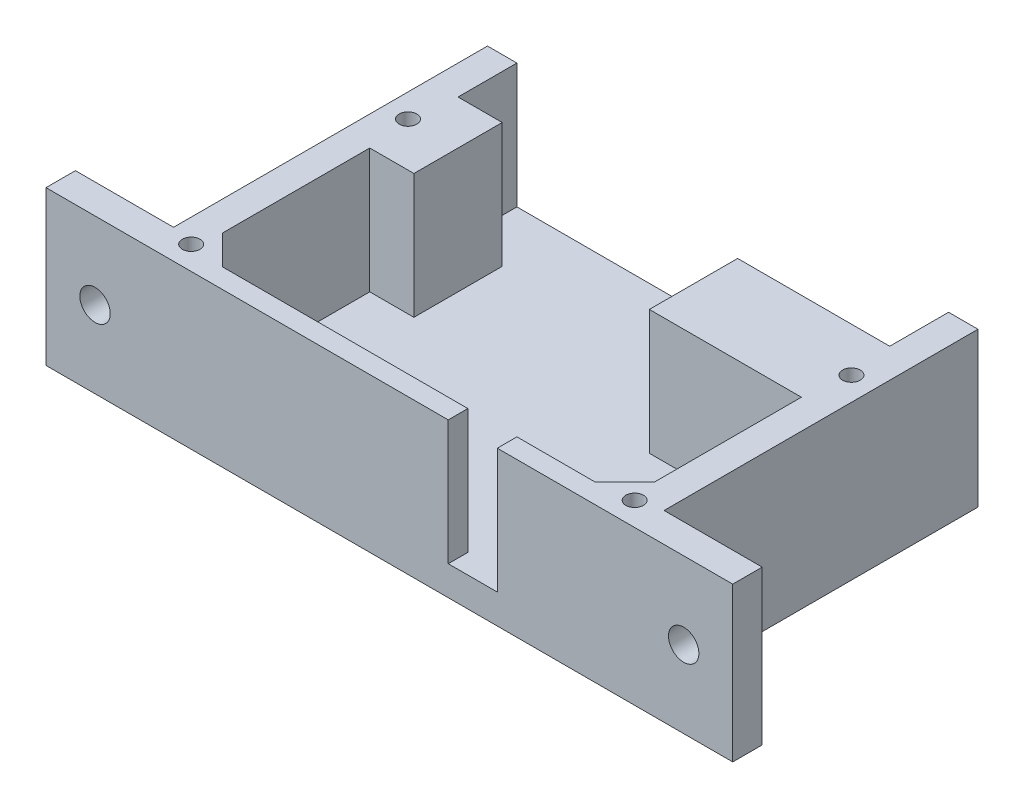
ISO-10303-21;
HEADER;
FILE_DESCRIPTION(('STEP AP214'),'2;1');
FILE_NAME('part.step','',(''),(''),'','','');
FILE_SCHEMA(('AUTOMOTIVE_DESIGN { 1 0 10303 214 1 1 1 1 }'));
ENDSEC;
DATA;
#1=APPLICATION_CONTEXT('core data for automotive mechanical design processes');
#2=APPLICATION_PROTOCOL_DEFINITION('international standard','automotive_design',2000,#1);
#3=PRODUCT_CONTEXT('',#1,'mechanical');
#4=PRODUCT('Part','Part','',(#3));
#5=PRODUCT_RELATED_PRODUCT_CATEGORY('part','',(#4));
#6=PRODUCT_DEFINITION_FORMATION('','',#4);
#7=PRODUCT_DEFINITION_CONTEXT('part definition',#1,'design');
#8=PRODUCT_DEFINITION('design','',#6,#7);
#9=PRODUCT_DEFINITION_SHAPE('','',#8);
#10=(LENGTH_UNIT() NAMED_UNIT(*) SI_UNIT(.MILLI.,.METRE.));
#11=(NAMED_UNIT(*) PLANE_ANGLE_UNIT() SI_UNIT($,.RADIAN.));
#12=(NAMED_UNIT(*) SI_UNIT($,.STERADIAN.) SOLID_ANGLE_UNIT());
#13=UNCERTAINTY_MEASURE_WITH_UNIT(LENGTH_MEASURE(1.E-05),#10,'distance_accuracy_value','');
#14=(GEOMETRIC_REPRESENTATION_CONTEXT(3) GLOBAL_UNCERTAINTY_ASSIGNED_CONTEXT((#13)) GLOBAL_UNIT_ASSIGNED_CONTEXT((#10,
#11,#12)) REPRESENTATION_CONTEXT('',''));
#15=CARTESIAN_POINT('',(0.,0.,0.));
#16=DIRECTION('',(0.,0.,1.));
#17=DIRECTION('',(1.,0.,0.));
#18=AXIS2_PLACEMENT_3D('',#15,#16,#17);
#19=CARTESIAN_POINT('',(25.,3.,-17.5));
#20=DIRECTION('',(-1.,0.,0.));
#21=DIRECTION('',(0.,0.,1.));
#22=AXIS2_PLACEMENT_3D('',#19,#20,#21);
#23=PLANE('',#22);
#24=DIRECTION('',(0.,1.,0.));
#25=VECTOR('',#24,1.);
#26=CARTESIAN_POINT('',(25.,15.7,14.5));
#27=LINE('',#26,#25);
#28=CARTESIAN_POINT('',(25.,0.,14.5));
#29=VERTEX_POINT('',#28);
#30=CARTESIAN_POINT('',(25.,15.7,14.5));
#31=VERTEX_POINT('',#30);
#32=EDGE_CURVE('E50',#29,#31,#27,.T.);
#33=ORIENTED_EDGE('',*,*,#32,.F.);
#34=DIRECTION('',(0.,0.,-1.));
#35=VECTOR('',#34,1.);
#36=CARTESIAN_POINT('',(25.,0.,-17.5));
#37=LINE('',#36,#35);
#38=CARTESIAN_POINT('',(25.,0.,-17.5));
#39=VERTEX_POINT('',#38);
#40=EDGE_CURVE('E425',#29,#39,#37,.T.);
#41=ORIENTED_EDGE('',*,*,#40,.T.);
#42=DIRECTION('',(0.,-1.,0.));
#43=VECTOR('',#42,1.);
#44=CARTESIAN_POINT('',(25.,3.,-17.5));
#45=LINE('',#44,#43);
#46=CARTESIAN_POINT('',(25.,15.7,-17.5));
#47=VERTEX_POINT('',#46);
#48=EDGE_CURVE('E436',#47,#39,#45,.T.);
#49=ORIENTED_EDGE('',*,*,#48,.F.);
#50=DIRECTION('',(0.,0.,-1.));
#51=VECTOR('',#50,1.);
#52=CARTESIAN_POINT('',(25.,15.7,0.));
#53=LINE('',#52,#51);
#54=EDGE_CURVE('E370',#31,#47,#53,.T.);
#55=ORIENTED_EDGE('',*,*,#54,.F.);
#56=EDGE_LOOP('',(#33,#41,#49,#55));
#57=FACE_BOUND('',#56,.T.);
#58=ADVANCED_FACE('F35',(#57),#23,.F.);
#59=CARTESIAN_POINT('',(-25.,3.,-17.5));
#60=DIRECTION('',(1.,0.,0.));
#61=DIRECTION('',(0.,0.,-1.));
#62=AXIS2_PLACEMENT_3D('',#59,#60,#61);
#63=PLANE('',#62);
#64=DIRECTION('',(0.,-1.,0.));
#65=VECTOR('',#64,1.);
#66=CARTESIAN_POINT('',(-25.,0.,14.5));
#67=LINE('',#66,#65);
#68=CARTESIAN_POINT('',(-25.,15.7,14.5));
#69=VERTEX_POINT('',#68);
#70=CARTESIAN_POINT('',(-25.,0.,14.5));
#71=VERTEX_POINT('',#70);
#72=EDGE_CURVE('E58',#69,#71,#67,.T.);
#73=ORIENTED_EDGE('',*,*,#72,.F.);
#74=DIRECTION('',(0.,0.,1.));
#75=VECTOR('',#74,1.);
#76=CARTESIAN_POINT('',(-25.,15.7,0.));
#77=LINE('',#76,#75);
#78=CARTESIAN_POINT('',(-25.,15.7,-17.5));
#79=VERTEX_POINT('',#78);
#80=EDGE_CURVE('E321',#79,#69,#77,.T.);
#81=ORIENTED_EDGE('',*,*,#80,.F.);
#82=DIRECTION('',(0.,-1.,0.));
#83=VECTOR('',#82,1.);
#84=CARTESIAN_POINT('',(-25.,3.,-17.5));
#85=LINE('',#84,#83);
#86=CARTESIAN_POINT('',(-25.,0.,-17.5));
#87=VERTEX_POINT('',#86);
#88=EDGE_CURVE('E429',#79,#87,#85,.T.);
#89=ORIENTED_EDGE('',*,*,#88,.T.);
#90=DIRECTION('',(0.,0.,1.));
#91=VECTOR('',#90,1.);
#92=CARTESIAN_POINT('',(-25.,0.,-17.5));
#93=LINE('',#92,#91);
#94=EDGE_CURVE('E220',#87,#71,#93,.T.);
#95=ORIENTED_EDGE('',*,*,#94,.T.);
#96=EDGE_LOOP('',(#73,#81,#89,#95));
#97=FACE_BOUND('',#96,.T.);
#98=ADVANCED_FACE('F550',(#97),#63,.F.);
#99=CARTESIAN_POINT('',(-25.,3.,-17.5));
#100=DIRECTION('',(0.,0.,1.));
#101=DIRECTION('',(1.,0.,0.));
#102=AXIS2_PLACEMENT_3D('',#99,#100,#101);
#103=PLANE('',#102);
#104=DIRECTION('',(-1.,0.,0.));
#105=VECTOR('',#104,1.);
#106=CARTESIAN_POINT('',(-25.,0.,-17.5));
#107=LINE('',#106,#105);
#108=EDGE_CURVE('E431',#39,#87,#107,.T.);
#109=ORIENTED_EDGE('',*,*,#108,.T.);
#110=ORIENTED_EDGE('',*,*,#88,.F.);
#111=DIRECTION('',(-1.,0.,0.));
#112=VECTOR('',#111,1.);
#113=CARTESIAN_POINT('',(0.,15.7,-17.5));
#114=LINE('',#113,#112);
#115=CARTESIAN_POINT('',(-22.,15.7,-17.5));
#116=VERTEX_POINT('',#115);
#117=EDGE_CURVE('E318',#116,#79,#114,.T.);
#118=ORIENTED_EDGE('',*,*,#117,.F.);
#119=DIRECTION('',(0.,-1.,0.));
#120=VECTOR('',#119,1.);
#121=CARTESIAN_POINT('',(-22.,15.7,-17.5));
#122=LINE('',#121,#120);
#123=CARTESIAN_POINT('',(-22.,3.,-17.5));
#124=VERTEX_POINT('',#123);
#125=EDGE_CURVE('E343',#116,#124,#122,.T.);
#126=ORIENTED_EDGE('',*,*,#125,.T.);
#127=DIRECTION('',(-1.,0.,0.));
#128=VECTOR('',#127,1.);
#129=CARTESIAN_POINT('',(-25.,3.,-17.5));
#130=LINE('',#129,#128);
#131=CARTESIAN_POINT('',(22.,3.,-17.5));
#132=VERTEX_POINT('',#131);
#133=EDGE_CURVE('E219',#132,#124,#130,.T.);
#134=ORIENTED_EDGE('',*,*,#133,.F.);
#135=DIRECTION('',(0.,-1.,0.));
#136=VECTOR('',#135,1.);
#137=CARTESIAN_POINT('',(22.,15.7,-17.5));
#138=LINE('',#137,#136);
#139=CARTESIAN_POINT('',(22.,15.7,-17.5));
#140=VERTEX_POINT('',#139);
#141=EDGE_CURVE('E416',#140,#132,#138,.T.);
#142=ORIENTED_EDGE('',*,*,#141,.F.);
#143=DIRECTION('',(-1.,0.,0.));
#144=VECTOR('',#143,1.);
#145=CARTESIAN_POINT('',(0.,15.7,-17.5));
#146=LINE('',#145,#144);
#147=EDGE_CURVE('E372',#47,#140,#146,.T.);
#148=ORIENTED_EDGE('',*,*,#147,.F.);
#149=ORIENTED_EDGE('',*,*,#48,.T.);
#150=EDGE_LOOP('',(#109,#110,#118,#126,#134,#142,#148,#149));
#151=FACE_BOUND('',#150,.T.);
#152=ADVANCED_FACE('F489',(#151),#103,.F.);
#153=CARTESIAN_POINT('',(-25.,3.,17.5));
#154=DIRECTION('',(0.,0.,-1.));
#155=DIRECTION('',(-1.,0.,0.));
#156=AXIS2_PLACEMENT_3D('',#153,#154,#155);
#157=PLANE('',#156);
#158=CARTESIAN_POINT('',(30.,7.85,17.5));
#159=DIRECTION('',(0.,0.,-1.));
#160=DIRECTION('',(-1.,0.,0.));
#161=AXIS2_PLACEMENT_3D('',#158,#159,#160);
#162=CIRCLE('',#161,1.55);
#163=CARTESIAN_POINT('',(28.45,7.85,17.5));
#164=VERTEX_POINT('',#163);
#165=EDGE_CURVE('E617',#164,#164,#162,.T.);
#166=ORIENTED_EDGE('',*,*,#165,.T.);
#167=EDGE_LOOP('',(#166));
#168=FACE_BOUND('',#167,.T.);
#169=CARTESIAN_POINT('',(-30.,7.85,17.5));
#170=DIRECTION('',(0.,0.,-1.));
#171=DIRECTION('',(-1.,0.,0.));
#172=AXIS2_PLACEMENT_3D('',#169,#170,#171);
#173=CIRCLE('',#172,1.55);
#174=CARTESIAN_POINT('',(-31.55,7.85,17.5));
#175=VERTEX_POINT('',#174);
#176=EDGE_CURVE('E236',#175,#175,#173,.T.);
#177=ORIENTED_EDGE('',*,*,#176,.T.);
#178=EDGE_LOOP('',(#177));
#179=FACE_BOUND('',#178,.T.);
#180=DIRECTION('',(1.,0.,0.));
#181=VECTOR('',#180,1.);
#182=CARTESIAN_POINT('',(-25.,0.,17.5));
#183=LINE('',#182,#181);
#184=CARTESIAN_POINT('',(-35.,0.,17.5));
#185=VERTEX_POINT('',#184);
#186=CARTESIAN_POINT('',(35.,0.,17.5));
#187=VERTEX_POINT('',#186);
#188=EDGE_CURVE('E208',#185,#187,#183,.T.);
#189=ORIENTED_EDGE('',*,*,#188,.T.);
#190=DIRECTION('',(0.,-1.,0.));
#191=VECTOR('',#190,1.);
#192=CARTESIAN_POINT('',(35.,15.7,17.5));
#193=LINE('',#192,#191);
#194=CARTESIAN_POINT('',(35.,15.7,17.5));
#195=VERTEX_POINT('',#194);
#196=EDGE_CURVE('E213',#195,#187,#193,.T.);
#197=ORIENTED_EDGE('',*,*,#196,.F.);
#198=DIRECTION('',(1.,0.,0.));
#199=VECTOR('',#198,1.);
#200=CARTESIAN_POINT('',(0.,15.7,17.5));
#201=LINE('',#200,#199);
#202=CARTESIAN_POINT('',(11.,15.7,17.5));
#203=VERTEX_POINT('',#202);
#204=EDGE_CURVE('E368',#203,#195,#201,.T.);
#205=ORIENTED_EDGE('',*,*,#204,.F.);
#206=DIRECTION('',(0.,-1.,0.));
#207=VECTOR('',#206,1.);
#208=CARTESIAN_POINT('',(11.,15.7,17.5));
#209=LINE('',#208,#207);
#210=CARTESIAN_POINT('',(11.,3.,17.5));
#211=VERTEX_POINT('',#210);
#212=EDGE_CURVE('E419',#203,#211,#209,.T.);
#213=ORIENTED_EDGE('',*,*,#212,.T.);
#214=DIRECTION('',(1.,0.,0.));
#215=VECTOR('',#214,1.);
#216=CARTESIAN_POINT('',(-25.,3.,17.5));
#217=LINE('',#216,#215);
#218=CARTESIAN_POINT('',(6.00000000000001,3.,17.5));
#219=VERTEX_POINT('',#218);
#220=EDGE_CURVE('E427',#219,#211,#217,.T.);
#221=ORIENTED_EDGE('',*,*,#220,.F.);
#222=DIRECTION('',(0.,-1.,0.));
#223=VECTOR('',#222,1.);
#224=CARTESIAN_POINT('',(6.00000000000001,15.7,17.5));
#225=LINE('',#224,#223);
#226=CARTESIAN_POINT('',(6.00000000000001,15.7,17.5));
#227=VERTEX_POINT('',#226);
#228=EDGE_CURVE('E325',#227,#219,#225,.T.);
#229=ORIENTED_EDGE('',*,*,#228,.F.);
#230=DIRECTION('',(1.,0.,0.));
#231=VECTOR('',#230,1.);
#232=CARTESIAN_POINT('',(0.,15.7,17.5));
#233=LINE('',#232,#231);
#234=CARTESIAN_POINT('',(-35.,15.7,17.5));
#235=VERTEX_POINT('',#234);
#236=EDGE_CURVE('E323',#235,#227,#233,.T.);
#237=ORIENTED_EDGE('',*,*,#236,.F.);
#238=DIRECTION('',(0.,1.,0.));
#239=VECTOR('',#238,1.);
#240=CARTESIAN_POINT('',(-35.,0.,17.5));
#241=LINE('',#240,#239);
#242=EDGE_CURVE('E215',#185,#235,#241,.T.);
#243=ORIENTED_EDGE('',*,*,#242,.F.);
#244=EDGE_LOOP('',(#189,#197,#205,#213,#221,#229,#237,#243));
#245=FACE_BOUND('',#244,.T.);
#246=ADVANCED_FACE('F210',(#168,#179,#245),#157,.F.);
#247=CARTESIAN_POINT('',(0.,3.,0.));
#248=DIRECTION('',(0.,1.,0.));
#249=DIRECTION('',(0.,0.,1.));
#250=AXIS2_PLACEMENT_3D('',#247,#248,#249);
#251=PLANE('',#250);
#252=DIRECTION('',(1.,0.,0.));
#253=VECTOR('',#252,1.);
#254=CARTESIAN_POINT('',(0.,3.,15.5));
#255=LINE('',#254,#253);
#256=CARTESIAN_POINT('',(11.,3.,15.5));
#257=VERTEX_POINT('',#256);
#258=CARTESIAN_POINT('',(19.,3.,15.5));
#259=VERTEX_POINT('',#258);
#260=EDGE_CURVE('E361',#257,#259,#255,.T.);
#261=ORIENTED_EDGE('',*,*,#260,.T.);
#262=DIRECTION('',(0.707106781186551,0.,-0.707106781186544));
#263=VECTOR('',#262,1.);
#264=CARTESIAN_POINT('',(17.2499999999999,3.,17.2500000000001));
#265=LINE('',#264,#263);
#266=CARTESIAN_POINT('',(22.,3.,12.5));
#267=VERTEX_POINT('',#266);
#268=EDGE_CURVE('E444',#259,#267,#265,.T.);
#269=ORIENTED_EDGE('',*,*,#268,.T.);
#270=DIRECTION('',(0.,0.,1.));
#271=VECTOR('',#270,1.);
#272=CARTESIAN_POINT('',(22.,3.,0.));
#273=LINE('',#272,#271);
#274=CARTESIAN_POINT('',(22.,3.,-2.5));
#275=VERTEX_POINT('',#274);
#276=EDGE_CURVE('E366',#275,#267,#273,.T.);
#277=ORIENTED_EDGE('',*,*,#276,.F.);
#278=DIRECTION('',(-1.,0.,0.));
#279=VECTOR('',#278,1.);
#280=CARTESIAN_POINT('',(0.,3.,-2.5));
#281=LINE('',#280,#279);
#282=CARTESIAN_POINT('',(6.50000000000001,3.,-2.5));
#283=VERTEX_POINT('',#282);
#284=EDGE_CURVE('E401',#275,#283,#281,.T.);
#285=ORIENTED_EDGE('',*,*,#284,.T.);
#286=DIRECTION('',(0.,0.,1.));
#287=VECTOR('',#286,1.);
#288=CARTESIAN_POINT('',(6.50000000000001,3.,0.));
#289=LINE('',#288,#287);
#290=CARTESIAN_POINT('',(6.50000000000001,3.,-11.5));
#291=VERTEX_POINT('',#290);
#292=EDGE_CURVE('E398',#291,#283,#289,.T.);
#293=ORIENTED_EDGE('',*,*,#292,.F.);
#294=DIRECTION('',(-1.,0.,0.));
#295=VECTOR('',#294,1.);
#296=CARTESIAN_POINT('',(0.,3.,-11.5));
#297=LINE('',#296,#295);
#298=CARTESIAN_POINT('',(22.,3.,-11.5));
#299=VERTEX_POINT('',#298);
#300=EDGE_CURVE('E395',#299,#291,#297,.T.);
#301=ORIENTED_EDGE('',*,*,#300,.F.);
#302=DIRECTION('',(0.,0.,1.));
#303=VECTOR('',#302,1.);
#304=CARTESIAN_POINT('',(22.,3.,0.));
#305=LINE('',#304,#303);
#306=EDGE_CURVE('E392',#132,#299,#305,.T.);
#307=ORIENTED_EDGE('',*,*,#306,.F.);
#308=ORIENTED_EDGE('',*,*,#133,.T.);
#309=DIRECTION('',(0.,0.,1.));
#310=VECTOR('',#309,1.);
#311=CARTESIAN_POINT('',(-22.,3.,0.));
#312=LINE('',#311,#310);
#313=CARTESIAN_POINT('',(-22.,3.,-11.5));
#314=VERTEX_POINT('',#313);
#315=EDGE_CURVE('E302',#124,#314,#312,.T.);
#316=ORIENTED_EDGE('',*,*,#315,.T.);
#317=DIRECTION('',(1.,0.,0.));
#318=VECTOR('',#317,1.);
#319=CARTESIAN_POINT('',(0.,3.,-11.5));
#320=LINE('',#319,#318);
#321=CARTESIAN_POINT('',(-17.5,3.,-11.5));
#322=VERTEX_POINT('',#321);
#323=EDGE_CURVE('E338',#314,#322,#320,.T.);
#324=ORIENTED_EDGE('',*,*,#323,.T.);
#325=DIRECTION('',(0.,0.,1.));
#326=VECTOR('',#325,1.);
#327=CARTESIAN_POINT('',(-17.5,3.,0.));
#328=LINE('',#327,#326);
#329=CARTESIAN_POINT('',(-17.5,3.,-2.5));
#330=VERTEX_POINT('',#329);
#331=EDGE_CURVE('E336',#322,#330,#328,.T.);
#332=ORIENTED_EDGE('',*,*,#331,.T.);
#333=DIRECTION('',(1.,0.,0.));
#334=VECTOR('',#333,1.);
#335=CARTESIAN_POINT('',(0.,3.,-2.50000000000001));
#336=LINE('',#335,#334);
#337=CARTESIAN_POINT('',(-22.,3.,-2.5));
#338=VERTEX_POINT('',#337);
#339=EDGE_CURVE('E333',#338,#330,#336,.T.);
#340=ORIENTED_EDGE('',*,*,#339,.F.);
#341=DIRECTION('',(0.,0.,1.));
#342=VECTOR('',#341,1.);
#343=CARTESIAN_POINT('',(-22.,3.,0.));
#344=LINE('',#343,#342);
#345=CARTESIAN_POINT('',(-22.,3.,12.5));
#346=VERTEX_POINT('',#345);
#347=EDGE_CURVE('E330',#338,#346,#344,.T.);
#348=ORIENTED_EDGE('',*,*,#347,.T.);
#349=DIRECTION('',(-0.707106781186543,0.,-0.707106781186552));
#350=VECTOR('',#349,1.);
#351=CARTESIAN_POINT('',(-17.2500000000001,3.,17.2499999999999));
#352=LINE('',#351,#350);
#353=CARTESIAN_POINT('',(-19.,3.,15.5));
#354=VERTEX_POINT('',#353);
#355=EDGE_CURVE('E442',#346,#354,#352,.F.);
#356=ORIENTED_EDGE('',*,*,#355,.T.);
#357=DIRECTION('',(1.,0.,0.));
#358=VECTOR('',#357,1.);
#359=CARTESIAN_POINT('',(0.,3.,15.5));
#360=LINE('',#359,#358);
#361=CARTESIAN_POINT('',(6.00000000000001,3.,15.5));
#362=VERTEX_POINT('',#361);
#363=EDGE_CURVE('E328',#354,#362,#360,.T.);
#364=ORIENTED_EDGE('',*,*,#363,.T.);
#365=DIRECTION('',(0.,0.,1.));
#366=VECTOR('',#365,1.);
#367=CARTESIAN_POINT('',(6.00000000000001,3.,0.));
#368=LINE('',#367,#366);
#369=EDGE_CURVE('E295',#362,#219,#368,.T.);
#370=ORIENTED_EDGE('',*,*,#369,.T.);
#371=ORIENTED_EDGE('',*,*,#220,.T.);
#372=DIRECTION('',(0.,0.,1.));
#373=VECTOR('',#372,1.);
#374=CARTESIAN_POINT('',(11.,3.,0.));
#375=LINE('',#374,#373);
#376=EDGE_CURVE('E389',#257,#211,#375,.T.);
#377=ORIENTED_EDGE('',*,*,#376,.F.);
#378=EDGE_LOOP('',(#261,#269,#277,#285,#293,#301,#307,#308,#316,#324,#332,#340,#348,#356,#364,
#370,#371,#377));
#379=FACE_BOUND('',#378,.T.);
#380=ADVANCED_FACE('F467',(#379),#251,.T.);
#381=CARTESIAN_POINT('',(0.,0.,0.));
#382=DIRECTION('',(0.,1.,0.));
#383=DIRECTION('',(0.,0.,1.));
#384=AXIS2_PLACEMENT_3D('',#381,#382,#383);
#385=PLANE('',#384);
#386=ORIENTED_EDGE('',*,*,#40,.F.);
#387=DIRECTION('',(-1.,0.,0.));
#388=VECTOR('',#387,1.);
#389=CARTESIAN_POINT('',(35.,0.,14.5));
#390=LINE('',#389,#388);
#391=CARTESIAN_POINT('',(35.,0.,14.5));
#392=VERTEX_POINT('',#391);
#393=EDGE_CURVE('E226',#392,#29,#390,.T.);
#394=ORIENTED_EDGE('',*,*,#393,.F.);
#395=DIRECTION('',(0.,0.,-1.));
#396=VECTOR('',#395,1.);
#397=CARTESIAN_POINT('',(35.,0.,17.5));
#398=LINE('',#397,#396);
#399=EDGE_CURVE('E223',#187,#392,#398,.T.);
#400=ORIENTED_EDGE('',*,*,#399,.F.);
#401=ORIENTED_EDGE('',*,*,#188,.F.);
#402=DIRECTION('',(0.,0.,1.));
#403=VECTOR('',#402,1.);
#404=CARTESIAN_POINT('',(-35.,0.,17.5));
#405=LINE('',#404,#403);
#406=CARTESIAN_POINT('',(-35.,0.,14.5));
#407=VERTEX_POINT('',#406);
#408=EDGE_CURVE('E252',#407,#185,#405,.T.);
#409=ORIENTED_EDGE('',*,*,#408,.F.);
#410=DIRECTION('',(1.,0.,0.));
#411=VECTOR('',#410,1.);
#412=CARTESIAN_POINT('',(-35.,0.,14.5));
#413=LINE('',#412,#411);
#414=EDGE_CURVE('E254',#407,#71,#413,.T.);
#415=ORIENTED_EDGE('',*,*,#414,.T.);
#416=ORIENTED_EDGE('',*,*,#94,.F.);
#417=ORIENTED_EDGE('',*,*,#108,.F.);
#418=EDGE_LOOP('',(#386,#394,#400,#401,#409,#415,#416,#417));
#419=FACE_BOUND('',#418,.T.);
#420=ADVANCED_FACE('F224',(#419),#385,.F.);
#421=CARTESIAN_POINT('',(0.,15.7,15.5));
#422=DIRECTION('',(0.,0.,-1.));
#423=DIRECTION('',(-1.,0.,0.));
#424=AXIS2_PLACEMENT_3D('',#421,#422,#423);
#425=PLANE('',#424);
#426=DIRECTION('',(1.,0.,0.));
#427=VECTOR('',#426,1.);
#428=CARTESIAN_POINT('',(0.,15.7,15.5));
#429=LINE('',#428,#427);
#430=CARTESIAN_POINT('',(11.,15.7,15.5));
#431=VERTEX_POINT('',#430);
#432=CARTESIAN_POINT('',(19.,15.7,15.5));
#433=VERTEX_POINT('',#432);
#434=EDGE_CURVE('E362',#431,#433,#429,.T.);
#435=ORIENTED_EDGE('',*,*,#434,.T.);
#436=DIRECTION('',(0.,-1.,0.));
#437=VECTOR('',#436,1.);
#438=CARTESIAN_POINT('',(19.,15.7,15.5));
#439=LINE('',#438,#437);
#440=EDGE_CURVE('E439',#433,#259,#439,.T.);
#441=ORIENTED_EDGE('',*,*,#440,.T.);
#442=ORIENTED_EDGE('',*,*,#260,.F.);
#443=DIRECTION('',(0.,-1.,0.));
#444=VECTOR('',#443,1.);
#445=CARTESIAN_POINT('',(11.,15.7,15.5));
#446=LINE('',#445,#444);
#447=EDGE_CURVE('E422',#431,#257,#446,.T.);
#448=ORIENTED_EDGE('',*,*,#447,.F.);
#449=EDGE_LOOP('',(#435,#441,#442,#448));
#450=FACE_BOUND('',#449,.T.);
#451=ADVANCED_FACE('F462',(#450),#425,.T.);
#452=CARTESIAN_POINT('',(11.,15.7,0.));
#453=DIRECTION('',(1.,0.,0.));
#454=DIRECTION('',(0.,0.,-1.));
#455=AXIS2_PLACEMENT_3D('',#452,#453,#454);
#456=PLANE('',#455);
#457=ORIENTED_EDGE('',*,*,#376,.T.);
#458=ORIENTED_EDGE('',*,*,#212,.F.);
#459=DIRECTION('',(0.,0.,1.));
#460=VECTOR('',#459,1.);
#461=CARTESIAN_POINT('',(11.,15.7,0.));
#462=LINE('',#461,#460);
#463=EDGE_CURVE('E365',#431,#203,#462,.T.);
#464=ORIENTED_EDGE('',*,*,#463,.F.);
#465=ORIENTED_EDGE('',*,*,#447,.T.);
#466=EDGE_LOOP('',(#457,#458,#464,#465));
#467=FACE_BOUND('',#466,.T.);
#468=ADVANCED_FACE('F530',(#467),#456,.F.);
#469=CARTESIAN_POINT('',(22.,15.7,0.));
#470=DIRECTION('',(1.,0.,0.));
#471=DIRECTION('',(0.,0.,-1.));
#472=AXIS2_PLACEMENT_3D('',#469,#470,#471);
#473=PLANE('',#472);
#474=ORIENTED_EDGE('',*,*,#306,.T.);
#475=DIRECTION('',(0.,-1.,0.));
#476=VECTOR('',#475,1.);
#477=CARTESIAN_POINT('',(22.,15.7,-11.5));
#478=LINE('',#477,#476);
#479=CARTESIAN_POINT('',(22.,15.7,-11.5));
#480=VERTEX_POINT('',#479);
#481=EDGE_CURVE('E413',#480,#299,#478,.T.);
#482=ORIENTED_EDGE('',*,*,#481,.F.);
#483=DIRECTION('',(0.,0.,1.));
#484=VECTOR('',#483,1.);
#485=CARTESIAN_POINT('',(22.,15.7,0.));
#486=LINE('',#485,#484);
#487=EDGE_CURVE('E374',#140,#480,#486,.T.);
#488=ORIENTED_EDGE('',*,*,#487,.F.);
#489=ORIENTED_EDGE('',*,*,#141,.T.);
#490=EDGE_LOOP('',(#474,#482,#488,#489));
#491=FACE_BOUND('',#490,.T.);
#492=ADVANCED_FACE('F486',(#491),#473,.F.);
#493=CARTESIAN_POINT('',(0.,15.7,-11.5));
#494=DIRECTION('',(0.,0.,1.));
#495=DIRECTION('',(1.,0.,0.));
#496=AXIS2_PLACEMENT_3D('',#493,#494,#495);
#497=PLANE('',#496);
#498=CARTESIAN_POINT('',(9.00000000000001,9.35,-11.5));
#499=DIRECTION('',(0.,0.,-1.));
#500=DIRECTION('',(-1.,0.,0.));
#501=AXIS2_PLACEMENT_3D('',#498,#499,#500);
#502=CIRCLE('',#501,0.9);
#503=CARTESIAN_POINT('',(8.10000000000001,9.35,-11.5));
#504=VERTEX_POINT('',#503);
#505=EDGE_CURVE('E261',#504,#504,#502,.T.);
#506=ORIENTED_EDGE('',*,*,#505,.F.);
#507=EDGE_LOOP('',(#506));
#508=FACE_BOUND('',#507,.T.);
#509=ORIENTED_EDGE('',*,*,#300,.T.);
#510=DIRECTION('',(0.,-1.,0.));
#511=VECTOR('',#510,1.);
#512=CARTESIAN_POINT('',(6.50000000000001,15.7,-11.5));
#513=LINE('',#512,#511);
#514=CARTESIAN_POINT('',(6.50000000000001,15.7,-11.5));
#515=VERTEX_POINT('',#514);
#516=EDGE_CURVE('E410',#515,#291,#513,.T.);
#517=ORIENTED_EDGE('',*,*,#516,.F.);
#518=DIRECTION('',(-1.,0.,0.));
#519=VECTOR('',#518,1.);
#520=CARTESIAN_POINT('',(0.,15.7,-11.5));
#521=LINE('',#520,#519);
#522=EDGE_CURVE('E376',#480,#515,#521,.T.);
#523=ORIENTED_EDGE('',*,*,#522,.F.);
#524=ORIENTED_EDGE('',*,*,#481,.T.);
#525=EDGE_LOOP('',(#509,#517,#523,#524));
#526=FACE_BOUND('',#525,.T.);
#527=ADVANCED_FACE('F477',(#508,#526),#497,.F.);
#528=CARTESIAN_POINT('',(6.50000000000001,15.7,0.));
#529=DIRECTION('',(1.,0.,0.));
#530=DIRECTION('',(0.,0.,-1.));
#531=AXIS2_PLACEMENT_3D('',#528,#529,#530);
#532=PLANE('',#531);
#533=ORIENTED_EDGE('',*,*,#292,.T.);
#534=DIRECTION('',(0.,-1.,0.));
#535=VECTOR('',#534,1.);
#536=CARTESIAN_POINT('',(6.50000000000001,15.7,-2.5));
#537=LINE('',#536,#535);
#538=CARTESIAN_POINT('',(6.50000000000001,15.7,-2.5));
#539=VERTEX_POINT('',#538);
#540=EDGE_CURVE('E407',#539,#283,#537,.T.);
#541=ORIENTED_EDGE('',*,*,#540,.F.);
#542=DIRECTION('',(0.,0.,1.));
#543=VECTOR('',#542,1.);
#544=CARTESIAN_POINT('',(6.50000000000001,15.7,0.));
#545=LINE('',#544,#543);
#546=EDGE_CURVE('E378',#515,#539,#545,.T.);
#547=ORIENTED_EDGE('',*,*,#546,.F.);
#548=ORIENTED_EDGE('',*,*,#516,.T.);
#549=EDGE_LOOP('',(#533,#541,#547,#548));
#550=FACE_BOUND('',#549,.T.);
#551=ADVANCED_FACE('F481',(#550),#532,.F.);
#552=CARTESIAN_POINT('',(0.,15.7,-2.5));
#553=DIRECTION('',(0.,0.,1.));
#554=DIRECTION('',(1.,0.,0.));
#555=AXIS2_PLACEMENT_3D('',#552,#553,#554);
#556=PLANE('',#555);
#557=ORIENTED_EDGE('',*,*,#284,.F.);
#558=DIRECTION('',(0.,-1.,0.));
#559=VECTOR('',#558,1.);
#560=CARTESIAN_POINT('',(22.,15.7,-2.5));
#561=LINE('',#560,#559);
#562=CARTESIAN_POINT('',(22.,15.7,-2.5));
#563=VERTEX_POINT('',#562);
#564=EDGE_CURVE('E386',#563,#275,#561,.T.);
#565=ORIENTED_EDGE('',*,*,#564,.F.);
#566=DIRECTION('',(-1.,0.,0.));
#567=VECTOR('',#566,1.);
#568=CARTESIAN_POINT('',(0.,15.7,-2.5));
#569=LINE('',#568,#567);
#570=EDGE_CURVE('E380',#563,#539,#569,.T.);
#571=ORIENTED_EDGE('',*,*,#570,.T.);
#572=ORIENTED_EDGE('',*,*,#540,.T.);
#573=EDGE_LOOP('',(#557,#565,#571,#572));
#574=FACE_BOUND('',#573,.T.);
#575=ADVANCED_FACE('F472',(#574),#556,.T.);
#576=CARTESIAN_POINT('',(22.,15.7,0.));
#577=DIRECTION('',(1.,0.,0.));
#578=DIRECTION('',(0.,0.,-1.));
#579=AXIS2_PLACEMENT_3D('',#576,#577,#578);
#580=PLANE('',#579);
#581=ORIENTED_EDGE('',*,*,#276,.T.);
#582=DIRECTION('',(0.,1.,0.));
#583=VECTOR('',#582,1.);
#584=CARTESIAN_POINT('',(22.,15.7,12.5));
#585=LINE('',#584,#583);
#586=CARTESIAN_POINT('',(22.,15.7,12.5));
#587=VERTEX_POINT('',#586);
#588=EDGE_CURVE('E446',#267,#587,#585,.T.);
#589=ORIENTED_EDGE('',*,*,#588,.T.);
#590=DIRECTION('',(0.,0.,1.));
#591=VECTOR('',#590,1.);
#592=CARTESIAN_POINT('',(22.,15.7,0.));
#593=LINE('',#592,#591);
#594=EDGE_CURVE('E383',#563,#587,#593,.T.);
#595=ORIENTED_EDGE('',*,*,#594,.F.);
#596=ORIENTED_EDGE('',*,*,#564,.T.);
#597=EDGE_LOOP('',(#581,#589,#595,#596));
#598=FACE_BOUND('',#597,.T.);
#599=ADVANCED_FACE('F469',(#598),#580,.F.);
#600=CARTESIAN_POINT('',(0.,15.7,0.));
#601=DIRECTION('',(0.,1.,0.));
#602=DIRECTION('',(0.,0.,1.));
#603=AXIS2_PLACEMENT_3D('',#600,#601,#602);
#604=PLANE('',#603);
#605=CARTESIAN_POINT('',(22.6,15.7,15.1));
#606=DIRECTION('',(0.,1.,0.));
#607=DIRECTION('',(0.,0.,1.));
#608=AXIS2_PLACEMENT_3D('',#605,#606,#607);
#609=CIRCLE('',#608,0.9);
#610=CARTESIAN_POINT('',(22.6,15.7,16.));
#611=VERTEX_POINT('',#610);
#612=EDGE_CURVE('E284',#611,#611,#609,.T.);
#613=ORIENTED_EDGE('',*,*,#612,.F.);
#614=EDGE_LOOP('',(#613));
#615=FACE_BOUND('',#614,.T.);
#616=CARTESIAN_POINT('',(22.6,15.7,-7.));
#617=DIRECTION('',(0.,1.,0.));
#618=DIRECTION('',(0.,0.,1.));
#619=AXIS2_PLACEMENT_3D('',#616,#617,#618);
#620=CIRCLE('',#619,0.9);
#621=CARTESIAN_POINT('',(22.6,15.7,-6.1));
#622=VERTEX_POINT('',#621);
#623=EDGE_CURVE('E277',#622,#622,#620,.T.);
#624=ORIENTED_EDGE('',*,*,#623,.F.);
#625=EDGE_LOOP('',(#624));
#626=FACE_BOUND('',#625,.T.);
#627=ORIENTED_EDGE('',*,*,#434,.F.);
#628=ORIENTED_EDGE('',*,*,#463,.T.);
#629=ORIENTED_EDGE('',*,*,#204,.T.);
#630=DIRECTION('',(0.,0.,1.));
#631=VECTOR('',#630,1.);
#632=CARTESIAN_POINT('',(35.,15.7,17.5));
#633=LINE('',#632,#631);
#634=CARTESIAN_POINT('',(35.,15.7,14.5));
#635=VERTEX_POINT('',#634);
#636=EDGE_CURVE('E234',#635,#195,#633,.T.);
#637=ORIENTED_EDGE('',*,*,#636,.F.);
#638=DIRECTION('',(-1.,0.,0.));
#639=VECTOR('',#638,1.);
#640=CARTESIAN_POINT('',(35.,15.7,14.5));
#641=LINE('',#640,#639);
#642=EDGE_CURVE('E242',#635,#31,#641,.T.);
#643=ORIENTED_EDGE('',*,*,#642,.T.);
#644=ORIENTED_EDGE('',*,*,#54,.T.);
#645=ORIENTED_EDGE('',*,*,#147,.T.);
#646=ORIENTED_EDGE('',*,*,#487,.T.);
#647=ORIENTED_EDGE('',*,*,#522,.T.);
#648=ORIENTED_EDGE('',*,*,#546,.T.);
#649=ORIENTED_EDGE('',*,*,#570,.F.);
#650=ORIENTED_EDGE('',*,*,#594,.T.);
#651=DIRECTION('',(-0.707106781186551,0.,0.707106781186544));
#652=VECTOR('',#651,1.);
#653=CARTESIAN_POINT('',(19.,15.7,15.5));
#654=LINE('',#653,#652);
#655=EDGE_CURVE('E43',#587,#433,#654,.T.);
#656=ORIENTED_EDGE('',*,*,#655,.T.);
#657=EDGE_LOOP('',(#627,#628,#629,#637,#643,#644,#645,#646,#647,#648,#649,#650,#656));
#658=FACE_BOUND('',#657,.T.);
#659=ADVANCED_FACE('F455',(#615,#626,#658),#604,.T.);
#660=CARTESIAN_POINT('',(6.00000000000001,15.7,0.));
#661=DIRECTION('',(1.,0.,0.));
#662=DIRECTION('',(0.,0.,-1.));
#663=AXIS2_PLACEMENT_3D('',#660,#661,#662);
#664=PLANE('',#663);
#665=ORIENTED_EDGE('',*,*,#369,.F.);
#666=DIRECTION('',(0.,-1.,0.));
#667=VECTOR('',#666,1.);
#668=CARTESIAN_POINT('',(6.00000000000001,15.7,15.5));
#669=LINE('',#668,#667);
#670=CARTESIAN_POINT('',(6.00000000000001,15.7,15.5));
#671=VERTEX_POINT('',#670);
#672=EDGE_CURVE('E358',#671,#362,#669,.T.);
#673=ORIENTED_EDGE('',*,*,#672,.F.);
#674=DIRECTION('',(0.,0.,1.));
#675=VECTOR('',#674,1.);
#676=CARTESIAN_POINT('',(6.00000000000001,15.7,0.));
#677=LINE('',#676,#675);
#678=EDGE_CURVE('E298',#671,#227,#677,.T.);
#679=ORIENTED_EDGE('',*,*,#678,.T.);
#680=ORIENTED_EDGE('',*,*,#228,.T.);
#681=EDGE_LOOP('',(#665,#673,#679,#680));
#682=FACE_BOUND('',#681,.T.);
#683=ADVANCED_FACE('F527',(#682),#664,.T.);
#684=CARTESIAN_POINT('',(0.,15.7,15.5));
#685=DIRECTION('',(0.,0.,-1.));
#686=DIRECTION('',(-1.,0.,0.));
#687=AXIS2_PLACEMENT_3D('',#684,#685,#686);
#688=PLANE('',#687);
#689=ORIENTED_EDGE('',*,*,#363,.F.);
#690=DIRECTION('',(0.,1.,0.));
#691=VECTOR('',#690,1.);
#692=CARTESIAN_POINT('',(-19.,15.7,15.5));
#693=LINE('',#692,#691);
#694=CARTESIAN_POINT('',(-19.,15.7,15.5));
#695=VERTEX_POINT('',#694);
#696=EDGE_CURVE('E451',#354,#695,#693,.T.);
#697=ORIENTED_EDGE('',*,*,#696,.T.);
#698=DIRECTION('',(1.,0.,0.));
#699=VECTOR('',#698,1.);
#700=CARTESIAN_POINT('',(0.,15.7,15.5));
#701=LINE('',#700,#699);
#702=EDGE_CURVE('E301',#695,#671,#701,.T.);
#703=ORIENTED_EDGE('',*,*,#702,.T.);
#704=ORIENTED_EDGE('',*,*,#672,.T.);
#705=EDGE_LOOP('',(#689,#697,#703,#704));
#706=FACE_BOUND('',#705,.T.);
#707=ADVANCED_FACE('F518',(#706),#688,.T.);
#708=CARTESIAN_POINT('',(-22.,15.7,0.));
#709=DIRECTION('',(1.,0.,0.));
#710=DIRECTION('',(0.,0.,-1.));
#711=AXIS2_PLACEMENT_3D('',#708,#709,#710);
#712=PLANE('',#711);
#713=DIRECTION('',(0.,0.,1.));
#714=VECTOR('',#713,1.);
#715=CARTESIAN_POINT('',(-22.,15.7,0.));
#716=LINE('',#715,#714);
#717=CARTESIAN_POINT('',(-22.,15.7,-2.5));
#718=VERTEX_POINT('',#717);
#719=CARTESIAN_POINT('',(-22.,15.7,12.5));
#720=VERTEX_POINT('',#719);
#721=EDGE_CURVE('E304',#718,#720,#716,.T.);
#722=ORIENTED_EDGE('',*,*,#721,.T.);
#723=DIRECTION('',(0.,-1.,0.));
#724=VECTOR('',#723,1.);
#725=CARTESIAN_POINT('',(-22.,3.,12.5));
#726=LINE('',#725,#724);
#727=EDGE_CURVE('E448',#720,#346,#726,.T.);
#728=ORIENTED_EDGE('',*,*,#727,.T.);
#729=ORIENTED_EDGE('',*,*,#347,.F.);
#730=DIRECTION('',(0.,-1.,0.));
#731=VECTOR('',#730,1.);
#732=CARTESIAN_POINT('',(-22.,15.7,-2.5));
#733=LINE('',#732,#731);
#734=EDGE_CURVE('E355',#718,#338,#733,.T.);
#735=ORIENTED_EDGE('',*,*,#734,.F.);
#736=EDGE_LOOP('',(#722,#728,#729,#735));
#737=FACE_BOUND('',#736,.T.);
#738=ADVANCED_FACE('F510',(#737),#712,.T.);
#739=CARTESIAN_POINT('',(0.,15.7,-2.50000000000001));
#740=DIRECTION('',(0.,0.,-1.));
#741=DIRECTION('',(-1.,0.,0.));
#742=AXIS2_PLACEMENT_3D('',#739,#740,#741);
#743=PLANE('',#742);
#744=ORIENTED_EDGE('',*,*,#339,.T.);
#745=DIRECTION('',(0.,-1.,0.));
#746=VECTOR('',#745,1.);
#747=CARTESIAN_POINT('',(-17.5,15.7,-2.5));
#748=LINE('',#747,#746);
#749=CARTESIAN_POINT('',(-17.5,15.7,-2.5));
#750=VERTEX_POINT('',#749);
#751=EDGE_CURVE('E352',#750,#330,#748,.T.);
#752=ORIENTED_EDGE('',*,*,#751,.F.);
#753=DIRECTION('',(1.,0.,0.));
#754=VECTOR('',#753,1.);
#755=CARTESIAN_POINT('',(0.,15.7,-2.50000000000001));
#756=LINE('',#755,#754);
#757=EDGE_CURVE('E307',#718,#750,#756,.T.);
#758=ORIENTED_EDGE('',*,*,#757,.F.);
#759=ORIENTED_EDGE('',*,*,#734,.T.);
#760=EDGE_LOOP('',(#744,#752,#758,#759));
#761=FACE_BOUND('',#760,.T.);
#762=ADVANCED_FACE('F506',(#761),#743,.F.);
#763=CARTESIAN_POINT('',(-17.5,15.7,0.));
#764=DIRECTION('',(1.,0.,0.));
#765=DIRECTION('',(0.,0.,-1.));
#766=AXIS2_PLACEMENT_3D('',#763,#764,#765);
#767=PLANE('',#766);
#768=ORIENTED_EDGE('',*,*,#331,.F.);
#769=DIRECTION('',(0.,-1.,0.));
#770=VECTOR('',#769,1.);
#771=CARTESIAN_POINT('',(-17.5,15.7,-11.5));
#772=LINE('',#771,#770);
#773=CARTESIAN_POINT('',(-17.5,15.7,-11.5));
#774=VERTEX_POINT('',#773);
#775=EDGE_CURVE('E349',#774,#322,#772,.T.);
#776=ORIENTED_EDGE('',*,*,#775,.F.);
#777=DIRECTION('',(0.,0.,1.));
#778=VECTOR('',#777,1.);
#779=CARTESIAN_POINT('',(-17.5,15.7,0.));
#780=LINE('',#779,#778);
#781=EDGE_CURVE('E309',#774,#750,#780,.T.);
#782=ORIENTED_EDGE('',*,*,#781,.T.);
#783=ORIENTED_EDGE('',*,*,#751,.T.);
#784=EDGE_LOOP('',(#768,#776,#782,#783));
#785=FACE_BOUND('',#784,.T.);
#786=ADVANCED_FACE('F502',(#785),#767,.T.);
#787=CARTESIAN_POINT('',(0.,15.7,-11.5));
#788=DIRECTION('',(0.,0.,-1.));
#789=DIRECTION('',(-1.,0.,0.));
#790=AXIS2_PLACEMENT_3D('',#787,#788,#789);
#791=PLANE('',#790);
#792=CARTESIAN_POINT('',(-20.,9.35,-11.5));
#793=DIRECTION('',(0.,0.,-1.));
#794=DIRECTION('',(-1.,0.,0.));
#795=AXIS2_PLACEMENT_3D('',#792,#793,#794);
#796=CIRCLE('',#795,0.9);
#797=CARTESIAN_POINT('',(-20.9,9.35,-11.5));
#798=VERTEX_POINT('',#797);
#799=EDGE_CURVE('E265',#798,#798,#796,.T.);
#800=ORIENTED_EDGE('',*,*,#799,.F.);
#801=EDGE_LOOP('',(#800));
#802=FACE_BOUND('',#801,.T.);
#803=ORIENTED_EDGE('',*,*,#323,.F.);
#804=DIRECTION('',(0.,-1.,0.));
#805=VECTOR('',#804,1.);
#806=CARTESIAN_POINT('',(-22.,15.7,-11.5));
#807=LINE('',#806,#805);
#808=CARTESIAN_POINT('',(-22.,15.7,-11.5));
#809=VERTEX_POINT('',#808);
#810=EDGE_CURVE('E346',#809,#314,#807,.T.);
#811=ORIENTED_EDGE('',*,*,#810,.F.);
#812=DIRECTION('',(1.,0.,0.));
#813=VECTOR('',#812,1.);
#814=CARTESIAN_POINT('',(0.,15.7,-11.5));
#815=LINE('',#814,#813);
#816=EDGE_CURVE('E312',#809,#774,#815,.T.);
#817=ORIENTED_EDGE('',*,*,#816,.T.);
#818=ORIENTED_EDGE('',*,*,#775,.T.);
#819=EDGE_LOOP('',(#803,#811,#817,#818));
#820=FACE_BOUND('',#819,.T.);
#821=ADVANCED_FACE('F498',(#802,#820),#791,.T.);
#822=CARTESIAN_POINT('',(-22.,15.7,0.));
#823=DIRECTION('',(1.,0.,0.));
#824=DIRECTION('',(0.,0.,-1.));
#825=AXIS2_PLACEMENT_3D('',#822,#823,#824);
#826=PLANE('',#825);
#827=ORIENTED_EDGE('',*,*,#315,.F.);
#828=ORIENTED_EDGE('',*,*,#125,.F.);
#829=DIRECTION('',(0.,0.,1.));
#830=VECTOR('',#829,1.);
#831=CARTESIAN_POINT('',(-22.,15.7,0.));
#832=LINE('',#831,#830);
#833=EDGE_CURVE('E315',#116,#809,#832,.T.);
#834=ORIENTED_EDGE('',*,*,#833,.T.);
#835=ORIENTED_EDGE('',*,*,#810,.T.);
#836=EDGE_LOOP('',(#827,#828,#834,#835));
#837=FACE_BOUND('',#836,.T.);
#838=ADVANCED_FACE('F494',(#837),#826,.T.);
#839=CARTESIAN_POINT('',(0.,15.7,0.));
#840=DIRECTION('',(0.,1.,0.));
#841=DIRECTION('',(0.,0.,1.));
#842=AXIS2_PLACEMENT_3D('',#839,#840,#841);
#843=PLANE('',#842);
#844=CARTESIAN_POINT('',(-22.6,15.7,-7.));
#845=DIRECTION('',(0.,1.,0.));
#846=DIRECTION('',(0.,0.,1.));
#847=AXIS2_PLACEMENT_3D('',#844,#845,#846);
#848=CIRCLE('',#847,0.9);
#849=CARTESIAN_POINT('',(-22.6,15.7,-6.1));
#850=VERTEX_POINT('',#849);
#851=EDGE_CURVE('E271',#850,#850,#848,.T.);
#852=ORIENTED_EDGE('',*,*,#851,.F.);
#853=EDGE_LOOP('',(#852));
#854=FACE_BOUND('',#853,.T.);
#855=CARTESIAN_POINT('',(-22.6,15.7,15.1));
#856=DIRECTION('',(0.,1.,0.));
#857=DIRECTION('',(0.,0.,1.));
#858=AXIS2_PLACEMENT_3D('',#855,#856,#857);
#859=CIRCLE('',#858,0.9);
#860=CARTESIAN_POINT('',(-22.6,15.7,16.));
#861=VERTEX_POINT('',#860);
#862=EDGE_CURVE('E283',#861,#861,#859,.T.);
#863=ORIENTED_EDGE('',*,*,#862,.F.);
#864=EDGE_LOOP('',(#863));
#865=FACE_BOUND('',#864,.T.);
#866=ORIENTED_EDGE('',*,*,#678,.F.);
#867=ORIENTED_EDGE('',*,*,#702,.F.);
#868=DIRECTION('',(0.707106781186543,0.,0.707106781186552));
#869=VECTOR('',#868,1.);
#870=CARTESIAN_POINT('',(-22.,15.7,12.5));
#871=LINE('',#870,#869);
#872=EDGE_CURVE('E11',#695,#720,#871,.F.);
#873=ORIENTED_EDGE('',*,*,#872,.T.);
#874=ORIENTED_EDGE('',*,*,#721,.F.);
#875=ORIENTED_EDGE('',*,*,#757,.T.);
#876=ORIENTED_EDGE('',*,*,#781,.F.);
#877=ORIENTED_EDGE('',*,*,#816,.F.);
#878=ORIENTED_EDGE('',*,*,#833,.F.);
#879=ORIENTED_EDGE('',*,*,#117,.T.);
#880=ORIENTED_EDGE('',*,*,#80,.T.);
#881=DIRECTION('',(1.,0.,0.));
#882=VECTOR('',#881,1.);
#883=CARTESIAN_POINT('',(-35.,15.7,14.5));
#884=LINE('',#883,#882);
#885=CARTESIAN_POINT('',(-35.,15.7,14.5));
#886=VERTEX_POINT('',#885);
#887=EDGE_CURVE('E258',#886,#69,#884,.T.);
#888=ORIENTED_EDGE('',*,*,#887,.F.);
#889=DIRECTION('',(0.,0.,-1.));
#890=VECTOR('',#889,1.);
#891=CARTESIAN_POINT('',(-35.,15.7,17.5));
#892=LINE('',#891,#890);
#893=EDGE_CURVE('E248',#235,#886,#892,.T.);
#894=ORIENTED_EDGE('',*,*,#893,.F.);
#895=ORIENTED_EDGE('',*,*,#236,.T.);
#896=EDGE_LOOP('',(#866,#867,#873,#874,#875,#876,#877,#878,#879,#880,#888,#894,#895));
#897=FACE_BOUND('',#896,.T.);
#898=ADVANCED_FACE('F522',(#854,#865,#897),#843,.T.);
#899=CARTESIAN_POINT('',(19.,15.7,15.5));
#900=DIRECTION('',(0.707106781186544,0.,0.707106781186551));
#901=DIRECTION('',(0.,-1.,0.));
#902=AXIS2_PLACEMENT_3D('',#899,#900,#901);
#903=PLANE('',#902);
#904=ORIENTED_EDGE('',*,*,#655,.F.);
#905=ORIENTED_EDGE('',*,*,#588,.F.);
#906=ORIENTED_EDGE('',*,*,#268,.F.);
#907=ORIENTED_EDGE('',*,*,#440,.F.);
#908=EDGE_LOOP('',(#904,#905,#906,#907));
#909=FACE_BOUND('',#908,.T.);
#910=ADVANCED_FACE('F465',(#909),#903,.F.);
#911=CARTESIAN_POINT('',(-22.,15.7,12.5));
#912=DIRECTION('',(0.707106781186552,0.,-0.707106781186543));
#913=DIRECTION('',(0.,1.,0.));
#914=AXIS2_PLACEMENT_3D('',#911,#912,#913);
#915=PLANE('',#914);
#916=ORIENTED_EDGE('',*,*,#872,.F.);
#917=ORIENTED_EDGE('',*,*,#696,.F.);
#918=ORIENTED_EDGE('',*,*,#355,.F.);
#919=ORIENTED_EDGE('',*,*,#727,.F.);
#920=EDGE_LOOP('',(#916,#917,#918,#919));
#921=FACE_BOUND('',#920,.T.);
#922=ADVANCED_FACE('F37',(#921),#915,.T.);
#923=CARTESIAN_POINT('',(-22.6,7.7,15.1));
#924=DIRECTION('',(0.,1.,0.));
#925=DIRECTION('',(0.,0.,1.));
#926=AXIS2_PLACEMENT_3D('',#923,#924,#925);
#927=CYLINDRICAL_SURFACE('',#926,0.9);
#928=CARTESIAN_POINT('',(-22.6,7.7,15.1));
#929=DIRECTION('',(0.,1.,0.));
#930=DIRECTION('',(0.,0.,1.));
#931=AXIS2_PLACEMENT_3D('',#928,#929,#930);
#932=CIRCLE('',#931,0.9);
#933=CARTESIAN_POINT('',(-22.6,7.7,16.));
#934=VERTEX_POINT('',#933);
#935=EDGE_CURVE('E292',#934,#934,#932,.T.);
#936=ORIENTED_EDGE('',*,*,#935,.F.);
#937=EDGE_LOOP('',(#936));
#938=FACE_BOUND('',#937,.T.);
#939=ORIENTED_EDGE('',*,*,#862,.T.);
#940=EDGE_LOOP('',(#939));
#941=FACE_BOUND('',#940,.T.);
#942=ADVANCED_FACE('F562',(#938,#941),#927,.F.);
#943=CARTESIAN_POINT('',(-22.6,7.7,15.1));
#944=DIRECTION('',(0.,1.,0.));
#945=DIRECTION('',(0.,0.,1.));
#946=AXIS2_PLACEMENT_3D('',#943,#944,#945);
#947=PLANE('',#946);
#948=ORIENTED_EDGE('',*,*,#935,.T.);
#949=EDGE_LOOP('',(#948));
#950=FACE_BOUND('',#949,.T.);
#951=ADVANCED_FACE('F823',(#950),#947,.T.);
#952=CARTESIAN_POINT('',(22.6,7.7,-7.));
#953=DIRECTION('',(0.,1.,0.));
#954=DIRECTION('',(0.,0.,1.));
#955=AXIS2_PLACEMENT_3D('',#952,#953,#954);
#956=CYLINDRICAL_SURFACE('',#955,0.9);
#957=CARTESIAN_POINT('',(22.6,7.7,-7.));
#958=DIRECTION('',(0.,1.,0.));
#959=DIRECTION('',(0.,0.,1.));
#960=AXIS2_PLACEMENT_3D('',#957,#958,#959);
#961=CIRCLE('',#960,0.9);
#962=CARTESIAN_POINT('',(22.6,7.7,-6.1));
#963=VERTEX_POINT('',#962);
#964=EDGE_CURVE('E287',#963,#963,#961,.T.);
#965=ORIENTED_EDGE('',*,*,#964,.F.);
#966=EDGE_LOOP('',(#965));
#967=FACE_BOUND('',#966,.T.);
#968=ORIENTED_EDGE('',*,*,#623,.T.);
#969=EDGE_LOOP('',(#968));
#970=FACE_BOUND('',#969,.T.);
#971=ADVANCED_FACE('F813',(#967,#970),#956,.F.);
#972=CARTESIAN_POINT('',(22.6,7.7,-7.));
#973=DIRECTION('',(0.,1.,0.));
#974=DIRECTION('',(0.,0.,1.));
#975=AXIS2_PLACEMENT_3D('',#972,#973,#974);
#976=PLANE('',#975);
#977=ORIENTED_EDGE('',*,*,#964,.T.);
#978=EDGE_LOOP('',(#977));
#979=FACE_BOUND('',#978,.T.);
#980=ADVANCED_FACE('F803',(#979),#976,.T.);
#981=CARTESIAN_POINT('',(22.6,7.7,15.1));
#982=DIRECTION('',(0.,1.,0.));
#983=DIRECTION('',(0.,0.,1.));
#984=AXIS2_PLACEMENT_3D('',#981,#982,#983);
#985=CYLINDRICAL_SURFACE('',#984,0.9);
#986=CARTESIAN_POINT('',(22.6,7.7,15.1));
#987=DIRECTION('',(0.,1.,0.));
#988=DIRECTION('',(0.,0.,1.));
#989=AXIS2_PLACEMENT_3D('',#986,#987,#988);
#990=CIRCLE('',#989,0.9);
#991=CARTESIAN_POINT('',(22.6,7.7,16.));
#992=VERTEX_POINT('',#991);
#993=EDGE_CURVE('E280',#992,#992,#990,.T.);
#994=ORIENTED_EDGE('',*,*,#993,.F.);
#995=EDGE_LOOP('',(#994));
#996=FACE_BOUND('',#995,.T.);
#997=ORIENTED_EDGE('',*,*,#612,.T.);
#998=EDGE_LOOP('',(#997));
#999=FACE_BOUND('',#998,.T.);
#1000=ADVANCED_FACE('F793',(#996,#999),#985,.F.);
#1001=CARTESIAN_POINT('',(22.6,7.7,15.1));
#1002=DIRECTION('',(0.,1.,0.));
#1003=DIRECTION('',(0.,0.,1.));
#1004=AXIS2_PLACEMENT_3D('',#1001,#1002,#1003);
#1005=PLANE('',#1004);
#1006=ORIENTED_EDGE('',*,*,#993,.T.);
#1007=EDGE_LOOP('',(#1006));
#1008=FACE_BOUND('',#1007,.T.);
#1009=ADVANCED_FACE('F783',(#1008),#1005,.T.);
#1010=CARTESIAN_POINT('',(-22.6,7.7,-7.));
#1011=DIRECTION('',(0.,1.,0.));
#1012=DIRECTION('',(0.,0.,1.));
#1013=AXIS2_PLACEMENT_3D('',#1010,#1011,#1012);
#1014=CYLINDRICAL_SURFACE('',#1013,0.9);
#1015=CARTESIAN_POINT('',(-22.6,7.7,-7.));
#1016=DIRECTION('',(0.,1.,0.));
#1017=DIRECTION('',(0.,0.,1.));
#1018=AXIS2_PLACEMENT_3D('',#1015,#1016,#1017);
#1019=CIRCLE('',#1018,0.9);
#1020=CARTESIAN_POINT('',(-22.6,7.7,-6.1));
#1021=VERTEX_POINT('',#1020);
#1022=EDGE_CURVE('E274',#1021,#1021,#1019,.T.);
#1023=ORIENTED_EDGE('',*,*,#1022,.F.);
#1024=EDGE_LOOP('',(#1023));
#1025=FACE_BOUND('',#1024,.T.);
#1026=ORIENTED_EDGE('',*,*,#851,.T.);
#1027=EDGE_LOOP('',(#1026));
#1028=FACE_BOUND('',#1027,.T.);
#1029=ADVANCED_FACE('F773',(#1025,#1028),#1014,.F.);
#1030=CARTESIAN_POINT('',(-22.6,7.7,-7.));
#1031=DIRECTION('',(0.,1.,0.));
#1032=DIRECTION('',(0.,0.,1.));
#1033=AXIS2_PLACEMENT_3D('',#1030,#1031,#1032);
#1034=PLANE('',#1033);
#1035=ORIENTED_EDGE('',*,*,#1022,.T.);
#1036=EDGE_LOOP('',(#1035));
#1037=FACE_BOUND('',#1036,.T.);
#1038=ADVANCED_FACE('F747',(#1037),#1034,.T.);
#1039=CARTESIAN_POINT('',(-20.,9.35,-3.49999999999999));
#1040=DIRECTION('',(0.,0.,-1.));
#1041=DIRECTION('',(-1.,0.,0.));
#1042=AXIS2_PLACEMENT_3D('',#1039,#1040,#1041);
#1043=CYLINDRICAL_SURFACE('',#1042,0.9);
#1044=CARTESIAN_POINT('',(-20.,9.35,-3.49999999999999));
#1045=DIRECTION('',(0.,0.,-1.));
#1046=DIRECTION('',(-1.,0.,0.));
#1047=AXIS2_PLACEMENT_3D('',#1044,#1045,#1046);
#1048=CIRCLE('',#1047,0.9);
#1049=CARTESIAN_POINT('',(-20.9,9.35,-3.49999999999999));
#1050=VERTEX_POINT('',#1049);
#1051=EDGE_CURVE('E268',#1050,#1050,#1048,.T.);
#1052=ORIENTED_EDGE('',*,*,#1051,.F.);
#1053=EDGE_LOOP('',(#1052));
#1054=FACE_BOUND('',#1053,.T.);
#1055=ORIENTED_EDGE('',*,*,#799,.T.);
#1056=EDGE_LOOP('',(#1055));
#1057=FACE_BOUND('',#1056,.T.);
#1058=ADVANCED_FACE('F737',(#1054,#1057),#1043,.F.);
#1059=CARTESIAN_POINT('',(-20.,9.35,-3.49999999999999));
#1060=DIRECTION('',(0.,0.,-1.));
#1061=DIRECTION('',(-1.,0.,0.));
#1062=AXIS2_PLACEMENT_3D('',#1059,#1060,#1061);
#1063=PLANE('',#1062);
#1064=ORIENTED_EDGE('',*,*,#1051,.T.);
#1065=EDGE_LOOP('',(#1064));
#1066=FACE_BOUND('',#1065,.T.);
#1067=ADVANCED_FACE('F727',(#1066),#1063,.T.);
#1068=CARTESIAN_POINT('',(9.00000000000001,9.35,-3.5));
#1069=DIRECTION('',(0.,0.,-1.));
#1070=DIRECTION('',(-1.,0.,0.));
#1071=AXIS2_PLACEMENT_3D('',#1068,#1069,#1070);
#1072=CYLINDRICAL_SURFACE('',#1071,0.9);
#1073=CARTESIAN_POINT('',(9.00000000000001,9.35,-3.5));
#1074=DIRECTION('',(0.,0.,-1.));
#1075=DIRECTION('',(-1.,0.,0.));
#1076=AXIS2_PLACEMENT_3D('',#1073,#1074,#1075);
#1077=CIRCLE('',#1076,0.9);
#1078=CARTESIAN_POINT('',(8.10000000000001,9.35,-3.5));
#1079=VERTEX_POINT('',#1078);
#1080=EDGE_CURVE('E262',#1079,#1079,#1077,.T.);
#1081=ORIENTED_EDGE('',*,*,#1080,.F.);
#1082=EDGE_LOOP('',(#1081));
#1083=FACE_BOUND('',#1082,.T.);
#1084=ORIENTED_EDGE('',*,*,#505,.T.);
#1085=EDGE_LOOP('',(#1084));
#1086=FACE_BOUND('',#1085,.T.);
#1087=ADVANCED_FACE('F716',(#1083,#1086),#1072,.F.);
#1088=CARTESIAN_POINT('',(9.00000000000001,9.35,-3.5));
#1089=DIRECTION('',(0.,0.,-1.));
#1090=DIRECTION('',(-1.,0.,0.));
#1091=AXIS2_PLACEMENT_3D('',#1088,#1089,#1090);
#1092=PLANE('',#1091);
#1093=ORIENTED_EDGE('',*,*,#1080,.T.);
#1094=EDGE_LOOP('',(#1093));
#1095=FACE_BOUND('',#1094,.T.);
#1096=ADVANCED_FACE('F664',(#1095),#1092,.T.);
#1097=CARTESIAN_POINT('',(-35.,0.,14.5));
#1098=DIRECTION('',(0.,0.,1.));
#1099=DIRECTION('',(0.,-1.,0.));
#1100=AXIS2_PLACEMENT_3D('',#1097,#1098,#1099);
#1101=PLANE('',#1100);
#1102=CARTESIAN_POINT('',(-30.,7.85,14.5));
#1103=DIRECTION('',(0.,0.,-1.));
#1104=DIRECTION('',(0.,1.,0.));
#1105=AXIS2_PLACEMENT_3D('',#1102,#1103,#1104);
#1106=CIRCLE('',#1105,1.55);
#1107=CARTESIAN_POINT('',(-30.,9.4,14.5));
#1108=VERTEX_POINT('',#1107);
#1109=EDGE_CURVE('E621',#1108,#1108,#1106,.T.);
#1110=ORIENTED_EDGE('',*,*,#1109,.F.);
#1111=EDGE_LOOP('',(#1110));
#1112=FACE_BOUND('',#1111,.T.);
#1113=ORIENTED_EDGE('',*,*,#72,.T.);
#1114=ORIENTED_EDGE('',*,*,#414,.F.);
#1115=DIRECTION('',(0.,-1.,0.));
#1116=VECTOR('',#1115,1.);
#1117=CARTESIAN_POINT('',(-35.,0.,14.5));
#1118=LINE('',#1117,#1116);
#1119=EDGE_CURVE('E250',#886,#407,#1118,.T.);
#1120=ORIENTED_EDGE('',*,*,#1119,.F.);
#1121=ORIENTED_EDGE('',*,*,#887,.T.);
#1122=EDGE_LOOP('',(#1113,#1114,#1120,#1121));
#1123=FACE_BOUND('',#1122,.T.);
#1124=ADVANCED_FACE('F545',(#1112,#1123),#1101,.F.);
#1125=CARTESIAN_POINT('',(-35.,0.,0.));
#1126=DIRECTION('',(-1.,0.,0.));
#1127=DIRECTION('',(0.,0.,1.));
#1128=AXIS2_PLACEMENT_3D('',#1125,#1126,#1127);
#1129=PLANE('',#1128);
#1130=ORIENTED_EDGE('',*,*,#242,.T.);
#1131=ORIENTED_EDGE('',*,*,#893,.T.);
#1132=ORIENTED_EDGE('',*,*,#1119,.T.);
#1133=ORIENTED_EDGE('',*,*,#408,.T.);
#1134=EDGE_LOOP('',(#1130,#1131,#1132,#1133));
#1135=FACE_BOUND('',#1134,.T.);
#1136=ADVANCED_FACE('F536',(#1135),#1129,.T.);
#1137=CARTESIAN_POINT('',(35.,15.7,14.5));
#1138=DIRECTION('',(0.,0.,1.));
#1139=DIRECTION('',(1.,0.,0.));
#1140=AXIS2_PLACEMENT_3D('',#1137,#1138,#1139);
#1141=PLANE('',#1140);
#1142=CARTESIAN_POINT('',(30.,7.85,14.5));
#1143=DIRECTION('',(0.,0.,-1.));
#1144=DIRECTION('',(0.,1.,0.));
#1145=AXIS2_PLACEMENT_3D('',#1142,#1143,#1144);
#1146=CIRCLE('',#1145,1.55);
#1147=CARTESIAN_POINT('',(30.,9.4,14.5));
#1148=VERTEX_POINT('',#1147);
#1149=EDGE_CURVE('E625',#1148,#1148,#1146,.T.);
#1150=ORIENTED_EDGE('',*,*,#1149,.F.);
#1151=EDGE_LOOP('',(#1150));
#1152=FACE_BOUND('',#1151,.T.);
#1153=ORIENTED_EDGE('',*,*,#32,.T.);
#1154=ORIENTED_EDGE('',*,*,#642,.F.);
#1155=DIRECTION('',(0.,1.,0.));
#1156=VECTOR('',#1155,1.);
#1157=CARTESIAN_POINT('',(35.,15.7,14.5));
#1158=LINE('',#1157,#1156);
#1159=EDGE_CURVE('E229',#392,#635,#1158,.T.);
#1160=ORIENTED_EDGE('',*,*,#1159,.F.);
#1161=ORIENTED_EDGE('',*,*,#393,.T.);
#1162=EDGE_LOOP('',(#1153,#1154,#1160,#1161));
#1163=FACE_BOUND('',#1162,.T.);
#1164=ADVANCED_FACE('F534',(#1152,#1163),#1141,.F.);
#1165=CARTESIAN_POINT('',(35.,0.,0.));
#1166=DIRECTION('',(1.,0.,0.));
#1167=DIRECTION('',(0.,0.,-1.));
#1168=AXIS2_PLACEMENT_3D('',#1165,#1166,#1167);
#1169=PLANE('',#1168);
#1170=ORIENTED_EDGE('',*,*,#196,.T.);
#1171=ORIENTED_EDGE('',*,*,#399,.T.);
#1172=ORIENTED_EDGE('',*,*,#1159,.T.);
#1173=ORIENTED_EDGE('',*,*,#636,.T.);
#1174=EDGE_LOOP('',(#1170,#1171,#1172,#1173));
#1175=FACE_BOUND('',#1174,.T.);
#1176=ADVANCED_FACE('F232',(#1175),#1169,.T.);
#1177=CARTESIAN_POINT('',(-30.,7.85,24.5));
#1178=DIRECTION('',(0.,0.,-1.));
#1179=DIRECTION('',(0.,1.,0.));
#1180=AXIS2_PLACEMENT_3D('',#1177,#1178,#1179);
#1181=CYLINDRICAL_SURFACE('',#1180,1.55);
#1182=ORIENTED_EDGE('',*,*,#1109,.T.);
#1183=EDGE_LOOP('',(#1182));
#1184=FACE_BOUND('',#1183,.T.);
#1185=ORIENTED_EDGE('',*,*,#176,.F.);
#1186=EDGE_LOOP('',(#1185));
#1187=FACE_BOUND('',#1186,.T.);
#1188=ADVANCED_FACE('F543',(#1184,#1187),#1181,.F.);
#1189=CARTESIAN_POINT('',(30.,7.85,24.5));
#1190=DIRECTION('',(0.,0.,-1.));
#1191=DIRECTION('',(0.,1.,0.));
#1192=AXIS2_PLACEMENT_3D('',#1189,#1190,#1191);
#1193=CYLINDRICAL_SURFACE('',#1192,1.55);
#1194=ORIENTED_EDGE('',*,*,#1149,.T.);
#1195=EDGE_LOOP('',(#1194));
#1196=FACE_BOUND('',#1195,.T.);
#1197=ORIENTED_EDGE('',*,*,#165,.F.);
#1198=EDGE_LOOP('',(#1197));
#1199=FACE_BOUND('',#1198,.T.);
#1200=ADVANCED_FACE('F630',(#1196,#1199),#1193,.F.);
#1201=CLOSED_SHELL('',(#58,#98,#152,#246,#380,#420,#451,#468,#492,#527,#551,#575,#599,#659,#683,
#707,#738,#762,#786,#821,#838,#898,#910,#922,#942,#951,#971,#980,#1000,#1009,#1029,#1038,#1058,
#1067,#1087,#1096,#1124,#1136,#1164,#1176,#1188,#1200));
#1202=MANIFOLD_SOLID_BREP('B2',#1201);
#1203=ADVANCED_BREP_SHAPE_REPRESENTATION('',(#18,#1202),#14);
#1204=SHAPE_DEFINITION_REPRESENTATION(#9,#1203);
ENDSEC;
END-ISO-10303-21;
